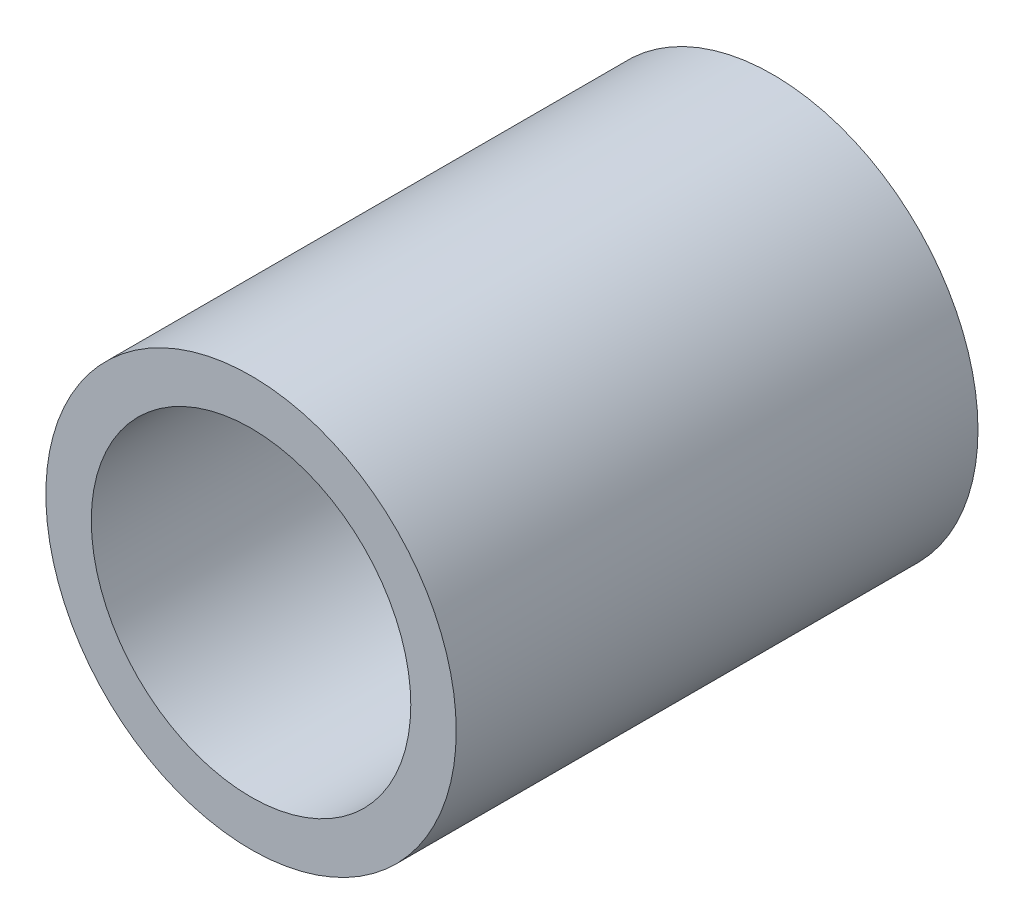
ISO-10303-21;
HEADER;
FILE_DESCRIPTION(('STEP AP214'),'2;1');
FILE_NAME('part.step','',(''),(''),'','','');
FILE_SCHEMA(('AUTOMOTIVE_DESIGN { 1 0 10303 214 1 1 1 1 }'));
ENDSEC;
DATA;
#1=APPLICATION_CONTEXT('core data for automotive mechanical design processes');
#2=APPLICATION_PROTOCOL_DEFINITION('international standard','automotive_design',2000,#1);
#3=PRODUCT_CONTEXT('',#1,'mechanical');
#4=PRODUCT('Part','Part','',(#3));
#5=PRODUCT_RELATED_PRODUCT_CATEGORY('part','',(#4));
#6=PRODUCT_DEFINITION_FORMATION('','',#4);
#7=PRODUCT_DEFINITION_CONTEXT('part definition',#1,'design');
#8=PRODUCT_DEFINITION('design','',#6,#7);
#9=PRODUCT_DEFINITION_SHAPE('','',#8);
#10=(LENGTH_UNIT() NAMED_UNIT(*) SI_UNIT(.MILLI.,.METRE.));
#11=(NAMED_UNIT(*) PLANE_ANGLE_UNIT() SI_UNIT($,.RADIAN.));
#12=(NAMED_UNIT(*) SI_UNIT($,.STERADIAN.) SOLID_ANGLE_UNIT());
#13=UNCERTAINTY_MEASURE_WITH_UNIT(LENGTH_MEASURE(1.E-05),#10,'distance_accuracy_value','');
#14=(GEOMETRIC_REPRESENTATION_CONTEXT(3) GLOBAL_UNCERTAINTY_ASSIGNED_CONTEXT((#13)) GLOBAL_UNIT_ASSIGNED_CONTEXT((#10,
#11,#12)) REPRESENTATION_CONTEXT('',''));
#15=CARTESIAN_POINT('',(0.,0.,0.));
#16=DIRECTION('',(0.,0.,1.));
#17=DIRECTION('',(1.,0.,0.));
#18=AXIS2_PLACEMENT_3D('',#15,#16,#17);
#19=CARTESIAN_POINT('',(0.,0.,8.9));
#20=DIRECTION('',(0.,0.,1.));
#21=DIRECTION('',(1.,0.,0.));
#22=AXIS2_PLACEMENT_3D('',#19,#20,#21);
#23=PLANE('',#22);
#24=CARTESIAN_POINT('',(0.,0.,8.9));
#25=DIRECTION('',(0.,0.,1.));
#26=DIRECTION('',(1.,0.,0.));
#27=AXIS2_PLACEMENT_3D('',#24,#25,#26);
#28=CIRCLE('',#27,3.5);
#29=CARTESIAN_POINT('',(3.5,0.,8.9));
#30=VERTEX_POINT('',#29);
#31=EDGE_CURVE('E10',#30,#30,#28,.T.);
#32=ORIENTED_EDGE('',*,*,#31,.T.);
#33=EDGE_LOOP('',(#32));
#34=FACE_BOUND('',#33,.T.);
#35=CARTESIAN_POINT('',(0.,0.,8.9));
#36=DIRECTION('',(0.,0.,1.));
#37=DIRECTION('',(1.,0.,0.));
#38=AXIS2_PLACEMENT_3D('',#35,#36,#37);
#39=CIRCLE('',#38,2.725);
#40=CARTESIAN_POINT('',(2.725,0.,8.9));
#41=VERTEX_POINT('',#40);
#42=EDGE_CURVE('E42',#41,#41,#39,.T.);
#43=ORIENTED_EDGE('',*,*,#42,.F.);
#44=EDGE_LOOP('',(#43));
#45=FACE_BOUND('',#44,.T.);
#46=ADVANCED_FACE('F31',(#34,#45),#23,.T.);
#47=CARTESIAN_POINT('',(0.,0.,0.));
#48=DIRECTION('',(0.,0.,1.));
#49=DIRECTION('',(1.,0.,0.));
#50=AXIS2_PLACEMENT_3D('',#47,#48,#49);
#51=PLANE('',#50);
#52=CARTESIAN_POINT('',(0.,0.,0.));
#53=DIRECTION('',(0.,0.,1.));
#54=DIRECTION('',(1.,0.,0.));
#55=AXIS2_PLACEMENT_3D('',#52,#53,#54);
#56=CIRCLE('',#55,3.5);
#57=CARTESIAN_POINT('',(3.5,0.,0.));
#58=VERTEX_POINT('',#57);
#59=EDGE_CURVE('E35',#58,#58,#56,.T.);
#60=ORIENTED_EDGE('',*,*,#59,.F.);
#61=EDGE_LOOP('',(#60));
#62=FACE_BOUND('',#61,.T.);
#63=CARTESIAN_POINT('',(0.,0.,0.));
#64=DIRECTION('',(0.,0.,1.));
#65=DIRECTION('',(1.,0.,0.));
#66=AXIS2_PLACEMENT_3D('',#63,#64,#65);
#67=CIRCLE('',#66,2.725);
#68=CARTESIAN_POINT('',(2.725,0.,0.));
#69=VERTEX_POINT('',#68);
#70=EDGE_CURVE('E44',#69,#69,#67,.T.);
#71=ORIENTED_EDGE('',*,*,#70,.T.);
#72=EDGE_LOOP('',(#71));
#73=FACE_BOUND('',#72,.T.);
#74=ADVANCED_FACE('F54',(#62,#73),#51,.F.);
#75=CARTESIAN_POINT('',(0.,0.,8.9));
#76=DIRECTION('',(0.,0.,-1.));
#77=DIRECTION('',(-1.,0.,0.));
#78=AXIS2_PLACEMENT_3D('',#75,#76,#77);
#79=CYLINDRICAL_SURFACE('',#78,3.5);
#80=ORIENTED_EDGE('',*,*,#31,.F.);
#81=EDGE_LOOP('',(#80));
#82=FACE_BOUND('',#81,.T.);
#83=ORIENTED_EDGE('',*,*,#59,.T.);
#84=EDGE_LOOP('',(#83));
#85=FACE_BOUND('',#84,.T.);
#86=ADVANCED_FACE('F33',(#82,#85),#79,.T.);
#87=CARTESIAN_POINT('',(0.,0.,8.9));
#88=DIRECTION('',(0.,0.,-1.));
#89=DIRECTION('',(-1.,0.,0.));
#90=AXIS2_PLACEMENT_3D('',#87,#88,#89);
#91=CYLINDRICAL_SURFACE('',#90,2.725);
#92=ORIENTED_EDGE('',*,*,#42,.T.);
#93=EDGE_LOOP('',(#92));
#94=FACE_BOUND('',#93,.T.);
#95=ORIENTED_EDGE('',*,*,#70,.F.);
#96=EDGE_LOOP('',(#95));
#97=FACE_BOUND('',#96,.T.);
#98=ADVANCED_FACE('F50',(#94,#97),#91,.F.);
#99=CLOSED_SHELL('',(#46,#74,#86,#98));
#100=MANIFOLD_SOLID_BREP('B2',#99);
#101=ADVANCED_BREP_SHAPE_REPRESENTATION('',(#18,#100),#14);
#102=SHAPE_DEFINITION_REPRESENTATION(#9,#101);
ENDSEC;
END-ISO-10303-21;
